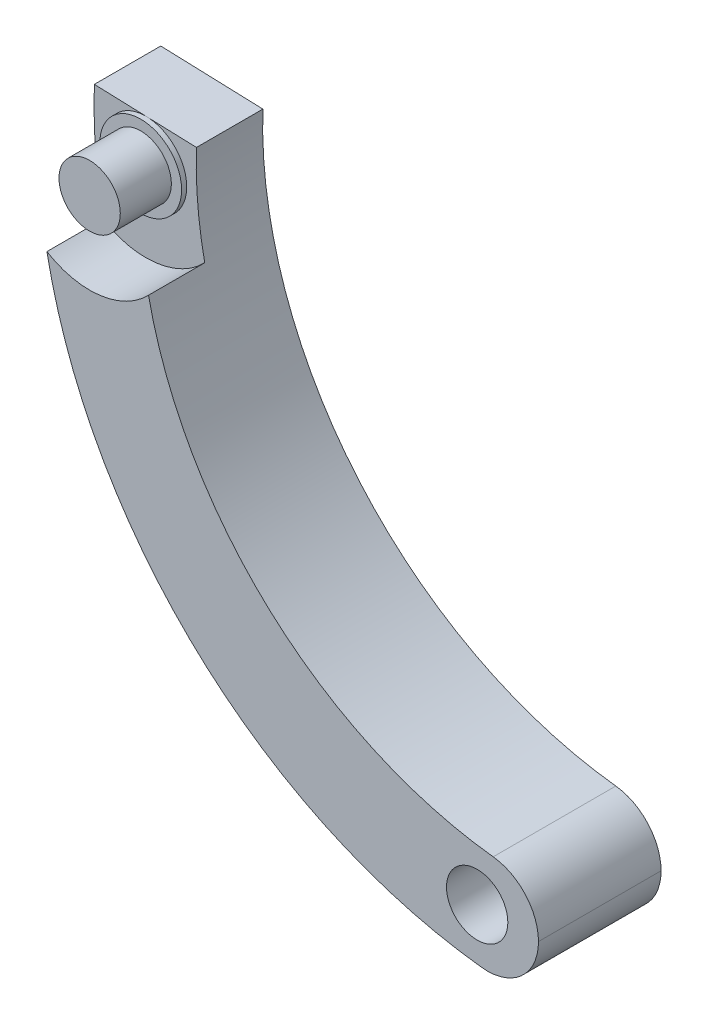
ISO-10303-21;
HEADER;
FILE_DESCRIPTION(('STEP AP214'),'2;1');
FILE_NAME('part.step','',(''),(''),'','','');
FILE_SCHEMA(('AUTOMOTIVE_DESIGN { 1 0 10303 214 1 1 1 1 }'));
ENDSEC;
DATA;
#1=APPLICATION_CONTEXT('core data for automotive mechanical design processes');
#2=APPLICATION_PROTOCOL_DEFINITION('international standard','automotive_design',2000,#1);
#3=PRODUCT_CONTEXT('',#1,'mechanical');
#4=PRODUCT('Part','Part','',(#3));
#5=PRODUCT_RELATED_PRODUCT_CATEGORY('part','',(#4));
#6=PRODUCT_DEFINITION_FORMATION('','',#4);
#7=PRODUCT_DEFINITION_CONTEXT('part definition',#1,'design');
#8=PRODUCT_DEFINITION('design','',#6,#7);
#9=PRODUCT_DEFINITION_SHAPE('','',#8);
#10=(LENGTH_UNIT() NAMED_UNIT(*) SI_UNIT(.MILLI.,.METRE.));
#11=(NAMED_UNIT(*) PLANE_ANGLE_UNIT() SI_UNIT($,.RADIAN.));
#12=(NAMED_UNIT(*) SI_UNIT($,.STERADIAN.) SOLID_ANGLE_UNIT());
#13=UNCERTAINTY_MEASURE_WITH_UNIT(LENGTH_MEASURE(1.E-05),#10,'distance_accuracy_value','');
#14=(GEOMETRIC_REPRESENTATION_CONTEXT(3) GLOBAL_UNCERTAINTY_ASSIGNED_CONTEXT((#13)) GLOBAL_UNIT_ASSIGNED_CONTEXT((#10,
#11,#12)) REPRESENTATION_CONTEXT('',''));
#15=CARTESIAN_POINT('',(0.,0.,0.));
#16=DIRECTION('',(0.,0.,1.));
#17=DIRECTION('',(1.,0.,0.));
#18=AXIS2_PLACEMENT_3D('',#15,#16,#17);
#19=CARTESIAN_POINT('',(-43.9309426651924,36.5358010332812,6.5));
#20=DIRECTION('',(0.,0.,1.));
#21=DIRECTION('',(1.,0.,0.));
#22=AXIS2_PLACEMENT_3D('',#19,#20,#21);
#23=PLANE('',#22);
#24=DIRECTION('',(-0.999390827019096,0.0348994967024965,0.));
#25=VECTOR('',#24,1.);
#26=CARTESIAN_POINT('',(-38.9762422537448,40.3610803713974,6.5));
#27=LINE('',#26,#25);
#28=CARTESIAN_POINT('',(-38.9762422537448,40.3610803713974,6.5));
#29=VERTEX_POINT('',#28);
#30=CARTESIAN_POINT('',(-43.609781542651,40.5228871288362,6.5));
#31=VERTEX_POINT('',#30);
#32=EDGE_CURVE('E111',#29,#31,#27,.T.);
#33=ORIENTED_EDGE('',*,*,#32,.T.);
#34=CARTESIAN_POINT('',(-43.9309426651924,36.5358010332812,6.5));
#35=DIRECTION('',(0.,0.,1.));
#36=DIRECTION('',(1.,0.,0.));
#37=AXIS2_PLACEMENT_3D('',#34,#35,#36);
#38=CIRCLE('',#37,4.00000000000001);
#39=CARTESIAN_POINT('',(-43.9731963888406,40.5355778549099,6.5));
#40=VERTEX_POINT('',#39);
#41=EDGE_CURVE('E100',#40,#31,#38,.T.);
#42=ORIENTED_EDGE('',*,*,#41,.F.);
#43=CARTESIAN_POINT('',(-48.9701505239357,40.7100753384224,6.5));
#44=VERTEX_POINT('',#43);
#45=EDGE_CURVE('E37',#40,#44,#27,.T.);
#46=ORIENTED_EDGE('',*,*,#45,.T.);
#47=CARTESIAN_POINT('',(0.,39.,6.5));
#48=DIRECTION('',(0.,0.,1.));
#49=DIRECTION('',(1.,0.,0.));
#50=AXIS2_PLACEMENT_3D('',#47,#48,#49);
#51=CIRCLE('',#50,49.);
#52=CARTESIAN_POINT('',(-48.1123588878088,29.7155548226785,6.5));
#53=VERTEX_POINT('',#52);
#54=EDGE_CURVE('E43',#44,#53,#51,.T.);
#55=ORIENTED_EDGE('',*,*,#54,.T.);
#56=CARTESIAN_POINT('',(-43.9309426651924,36.5358010332812,6.5));
#57=DIRECTION('',(0.,0.,1.));
#58=DIRECTION('',(1.,0.,0.));
#59=AXIS2_PLACEMENT_3D('',#56,#57,#58);
#60=CIRCLE('',#59,8.);
#61=CARTESIAN_POINT('',(-38.1679636420063,30.9871009352117,6.5));
#62=VERTEX_POINT('',#61);
#63=EDGE_CURVE('E170',#53,#62,#60,.T.);
#64=ORIENTED_EDGE('',*,*,#63,.T.);
#65=CARTESIAN_POINT('',(0.,39.,6.5));
#66=DIRECTION('',(0.,0.,1.));
#67=DIRECTION('',(1.,0.,0.));
#68=AXIS2_PLACEMENT_3D('',#65,#66,#67);
#69=CIRCLE('',#68,39.);
#70=EDGE_CURVE('E118',#62,#29,#69,.F.);
#71=ORIENTED_EDGE('',*,*,#70,.T.);
#72=EDGE_LOOP('',(#33,#42,#46,#55,#64,#71));
#73=FACE_BOUND('',#72,.T.);
#74=ADVANCED_FACE('F33',(#73),#23,.T.);
#75=CARTESIAN_POINT('',(-38.9762422537448,40.3610803713974,12.));
#76=DIRECTION('',(-0.0348994967024965,-0.999390827019096,0.));
#77=DIRECTION('',(0.999390827019096,-0.0348994967024965,0.));
#78=AXIS2_PLACEMENT_3D('',#75,#76,#77);
#79=PLANE('',#78);
#80=ORIENTED_EDGE('',*,*,#32,.F.);
#81=DIRECTION('',(0.,0.,-1.));
#82=VECTOR('',#81,1.);
#83=CARTESIAN_POINT('',(-38.9762422537448,40.3610803713974,12.));
#84=LINE('',#83,#82);
#85=CARTESIAN_POINT('',(-38.9762422537448,40.3610803713974,0.));
#86=VERTEX_POINT('',#85);
#87=EDGE_CURVE('E152',#29,#86,#84,.T.);
#88=ORIENTED_EDGE('',*,*,#87,.T.);
#89=DIRECTION('',(-0.999390827019096,0.0348994967024965,0.));
#90=VECTOR('',#89,1.);
#91=CARTESIAN_POINT('',(-38.9762422537448,40.3610803713974,0.));
#92=LINE('',#91,#90);
#93=CARTESIAN_POINT('',(-48.9701505239357,40.7100753384224,0.));
#94=VERTEX_POINT('',#93);
#95=EDGE_CURVE('E146',#86,#94,#92,.T.);
#96=ORIENTED_EDGE('',*,*,#95,.T.);
#97=DIRECTION('',(0.,0.,-1.));
#98=VECTOR('',#97,1.);
#99=CARTESIAN_POINT('',(-48.9701505239357,40.7100753384224,12.));
#100=LINE('',#99,#98);
#101=EDGE_CURVE('E143',#44,#94,#100,.T.);
#102=ORIENTED_EDGE('',*,*,#101,.F.);
#103=ORIENTED_EDGE('',*,*,#45,.F.);
#104=CARTESIAN_POINT('',(-43.9309426651924,36.5358010332812,6.5));
#105=DIRECTION('',(0.,0.,1.));
#106=DIRECTION('',(0.0802902806353396,0.996771523888749,0.));
#107=AXIS2_PLACEMENT_3D('',#104,#105,#106);
#108=CIRCLE('',#107,4.00000000000001);
#109=EDGE_CURVE('E50',#31,#40,#108,.T.);
#110=ORIENTED_EDGE('',*,*,#109,.F.);
#111=EDGE_LOOP('',(#80,#88,#96,#102,#103,#110));
#112=FACE_BOUND('',#111,.T.);
#113=ADVANCED_FACE('F110',(#112),#79,.F.);
#114=CARTESIAN_POINT('',(0.,39.,12.));
#115=DIRECTION('',(0.,0.,-1.));
#116=DIRECTION('',(-1.,0.,0.));
#117=AXIS2_PLACEMENT_3D('',#114,#115,#116);
#118=CYLINDRICAL_SURFACE('',#117,39.);
#119=ORIENTED_EDGE('',*,*,#70,.F.);
#120=DIRECTION('',(0.,0.,1.));
#121=VECTOR('',#120,1.);
#122=CARTESIAN_POINT('',(-38.1679636420063,30.9871009352117,9.25));
#123=LINE('',#122,#121);
#124=CARTESIAN_POINT('',(-38.1679636420063,30.9871009352117,12.));
#125=VERTEX_POINT('',#124);
#126=EDGE_CURVE('E121',#62,#125,#123,.T.);
#127=ORIENTED_EDGE('',*,*,#126,.T.);
#128=CARTESIAN_POINT('',(0.,39.,12.));
#129=DIRECTION('',(0.,0.,-1.));
#130=DIRECTION('',(-1.,0.,0.));
#131=AXIS2_PLACEMENT_3D('',#128,#129,#130);
#132=CIRCLE('',#131,39.);
#133=CARTESIAN_POINT('',(-4.43181818181818,0.252626055391753,12.));
#134=VERTEX_POINT('',#133);
#135=EDGE_CURVE('E137',#134,#125,#132,.T.);
#136=ORIENTED_EDGE('',*,*,#135,.F.);
#137=DIRECTION('',(0.,0.,-1.));
#138=VECTOR('',#137,1.);
#139=CARTESIAN_POINT('',(-4.43181818181818,0.252626055391753,12.));
#140=LINE('',#139,#138);
#141=CARTESIAN_POINT('',(-4.43181818181818,0.252626055391753,0.));
#142=VERTEX_POINT('',#141);
#143=EDGE_CURVE('E165',#134,#142,#140,.T.);
#144=ORIENTED_EDGE('',*,*,#143,.T.);
#145=CARTESIAN_POINT('',(0.,39.,0.));
#146=DIRECTION('',(0.,0.,-1.));
#147=DIRECTION('',(-1.,0.,0.));
#148=AXIS2_PLACEMENT_3D('',#145,#146,#147);
#149=CIRCLE('',#148,39.);
#150=EDGE_CURVE('E136',#142,#86,#149,.T.);
#151=ORIENTED_EDGE('',*,*,#150,.T.);
#152=ORIENTED_EDGE('',*,*,#87,.F.);
#153=EDGE_LOOP('',(#119,#127,#136,#144,#151,#152));
#154=FACE_BOUND('',#153,.T.);
#155=ADVANCED_FACE('F219',(#154),#118,.F.);
#156=CARTESIAN_POINT('',(0.,39.,12.));
#157=DIRECTION('',(0.,0.,-1.));
#158=DIRECTION('',(-1.,0.,0.));
#159=AXIS2_PLACEMENT_3D('',#156,#157,#158);
#160=CYLINDRICAL_SURFACE('',#159,49.);
#161=CARTESIAN_POINT('',(0.,39.,12.));
#162=DIRECTION('',(0.,0.,1.));
#163=DIRECTION('',(-1.,0.,0.));
#164=AXIS2_PLACEMENT_3D('',#161,#162,#163);
#165=CIRCLE('',#164,49.);
#166=CARTESIAN_POINT('',(-48.1123588878088,29.7155548226785,12.));
#167=VERTEX_POINT('',#166);
#168=CARTESIAN_POINT('',(-5.56818181818182,-9.68259803296934,12.));
#169=VERTEX_POINT('',#168);
#170=EDGE_CURVE('E140',#167,#169,#165,.T.);
#171=ORIENTED_EDGE('',*,*,#170,.F.);
#172=DIRECTION('',(0.,0.,1.));
#173=VECTOR('',#172,1.);
#174=CARTESIAN_POINT('',(-48.1123588878088,29.7155548226785,9.25));
#175=LINE('',#174,#173);
#176=EDGE_CURVE('E59',#167,#53,#175,.F.);
#177=ORIENTED_EDGE('',*,*,#176,.T.);
#178=ORIENTED_EDGE('',*,*,#54,.F.);
#179=ORIENTED_EDGE('',*,*,#101,.T.);
#180=CARTESIAN_POINT('',(0.,39.,0.));
#181=DIRECTION('',(0.,0.,1.));
#182=DIRECTION('',(-1.,0.,0.));
#183=AXIS2_PLACEMENT_3D('',#180,#181,#182);
#184=CIRCLE('',#183,49.);
#185=CARTESIAN_POINT('',(-5.56818181818182,-9.68259803296934,0.));
#186=VERTEX_POINT('',#185);
#187=EDGE_CURVE('E141',#94,#186,#184,.T.);
#188=ORIENTED_EDGE('',*,*,#187,.T.);
#189=DIRECTION('',(0.,0.,-1.));
#190=VECTOR('',#189,1.);
#191=CARTESIAN_POINT('',(-5.56818181818182,-9.68259803296934,12.));
#192=LINE('',#191,#190);
#193=EDGE_CURVE('E158',#186,#169,#192,.F.);
#194=ORIENTED_EDGE('',*,*,#193,.T.);
#195=EDGE_LOOP('',(#171,#177,#178,#179,#188,#194));
#196=FACE_BOUND('',#195,.T.);
#197=ADVANCED_FACE('F177',(#196),#160,.T.);
#198=CARTESIAN_POINT('',(0.,39.,12.));
#199=DIRECTION('',(0.,0.,-1.));
#200=DIRECTION('',(-1.,0.,0.));
#201=AXIS2_PLACEMENT_3D('',#198,#199,#200);
#202=PLANE('',#201);
#203=CARTESIAN_POINT('',(-6.,-4.58898943540673,12.));
#204=DIRECTION('',(0.,0.,-1.));
#205=DIRECTION('',(-1.,0.,0.));
#206=AXIS2_PLACEMENT_3D('',#203,#204,#205);
#207=CIRCLE('',#206,3.);
#208=CARTESIAN_POINT('',(-9.,-4.58898943540673,12.));
#209=VERTEX_POINT('',#208);
#210=EDGE_CURVE('E133',#209,#209,#207,.T.);
#211=ORIENTED_EDGE('',*,*,#210,.T.);
#212=EDGE_LOOP('',(#211));
#213=FACE_BOUND('',#212,.T.);
#214=ORIENTED_EDGE('',*,*,#135,.T.);
#215=CARTESIAN_POINT('',(-43.9309426651924,36.5358010332812,12.));
#216=DIRECTION('',(0.,0.,1.));
#217=DIRECTION('',(1.,0.,0.));
#218=AXIS2_PLACEMENT_3D('',#215,#216,#217);
#219=CIRCLE('',#218,8.);
#220=EDGE_CURVE('E174',#167,#125,#219,.T.);
#221=ORIENTED_EDGE('',*,*,#220,.F.);
#222=ORIENTED_EDGE('',*,*,#170,.T.);
#223=CARTESIAN_POINT('',(-5.,-4.71498598878879,12.));
#224=DIRECTION('',(0.,0.,-1.));
#225=DIRECTION('',(-1.,0.,0.));
#226=AXIS2_PLACEMENT_3D('',#223,#224,#225);
#227=CIRCLE('',#226,5.);
#228=CARTESIAN_POINT('',(0.,-4.71498598878879,12.));
#229=VERTEX_POINT('',#228);
#230=EDGE_CURVE('E163',#169,#229,#227,.F.);
#231=ORIENTED_EDGE('',*,*,#230,.T.);
#232=CARTESIAN_POINT('',(-5.,-4.71498598878879,12.));
#233=DIRECTION('',(0.,0.,-1.));
#234=DIRECTION('',(-1.,0.,0.));
#235=AXIS2_PLACEMENT_3D('',#232,#233,#234);
#236=CIRCLE('',#235,5.);
#237=EDGE_CURVE('E161',#229,#134,#236,.F.);
#238=ORIENTED_EDGE('',*,*,#237,.T.);
#239=EDGE_LOOP('',(#214,#221,#222,#231,#238));
#240=FACE_BOUND('',#239,.T.);
#241=ADVANCED_FACE('F211',(#213,#240),#202,.F.);
#242=CARTESIAN_POINT('',(0.,39.,0.));
#243=DIRECTION('',(0.,0.,-1.));
#244=DIRECTION('',(-1.,0.,0.));
#245=AXIS2_PLACEMENT_3D('',#242,#243,#244);
#246=PLANE('',#245);
#247=CARTESIAN_POINT('',(-6.,-4.58898943540673,0.));
#248=DIRECTION('',(0.,0.,1.));
#249=DIRECTION('',(1.,0.,0.));
#250=AXIS2_PLACEMENT_3D('',#247,#248,#249);
#251=CIRCLE('',#250,3.);
#252=CARTESIAN_POINT('',(-3.,-4.58898943540673,0.));
#253=VERTEX_POINT('',#252);
#254=EDGE_CURVE('E130',#253,#253,#251,.T.);
#255=ORIENTED_EDGE('',*,*,#254,.T.);
#256=EDGE_LOOP('',(#255));
#257=FACE_BOUND('',#256,.T.);
#258=CARTESIAN_POINT('',(-5.,-4.71498598878879,0.));
#259=DIRECTION('',(0.,0.,-1.));
#260=DIRECTION('',(-1.,0.,0.));
#261=AXIS2_PLACEMENT_3D('',#258,#259,#260);
#262=CIRCLE('',#261,5.);
#263=CARTESIAN_POINT('',(0.,-4.71498598878879,0.));
#264=VERTEX_POINT('',#263);
#265=EDGE_CURVE('E154',#142,#264,#262,.T.);
#266=ORIENTED_EDGE('',*,*,#265,.T.);
#267=CARTESIAN_POINT('',(-5.,-4.71498598878879,0.));
#268=DIRECTION('',(0.,0.,-1.));
#269=DIRECTION('',(-1.,0.,0.));
#270=AXIS2_PLACEMENT_3D('',#267,#268,#269);
#271=CIRCLE('',#270,5.);
#272=EDGE_CURVE('E156',#264,#186,#271,.T.);
#273=ORIENTED_EDGE('',*,*,#272,.T.);
#274=ORIENTED_EDGE('',*,*,#187,.F.);
#275=ORIENTED_EDGE('',*,*,#95,.F.);
#276=ORIENTED_EDGE('',*,*,#150,.F.);
#277=EDGE_LOOP('',(#266,#273,#274,#275,#276));
#278=FACE_BOUND('',#277,.T.);
#279=ADVANCED_FACE('F209',(#257,#278),#246,.T.);
#280=CARTESIAN_POINT('',(-6.,-4.58898943540673,0.));
#281=DIRECTION('',(0.,0.,1.));
#282=DIRECTION('',(1.,0.,0.));
#283=AXIS2_PLACEMENT_3D('',#280,#281,#282);
#284=CYLINDRICAL_SURFACE('',#283,3.);
#285=ORIENTED_EDGE('',*,*,#254,.F.);
#286=EDGE_LOOP('',(#285));
#287=FACE_BOUND('',#286,.T.);
#288=ORIENTED_EDGE('',*,*,#210,.F.);
#289=EDGE_LOOP('',(#288));
#290=FACE_BOUND('',#289,.T.);
#291=ADVANCED_FACE('F206',(#287,#290),#284,.F.);
#292=CARTESIAN_POINT('',(-5.,-4.71498598878879,12.));
#293=DIRECTION('',(0.,0.,-1.));
#294=DIRECTION('',(-1.,0.,0.));
#295=AXIS2_PLACEMENT_3D('',#292,#293,#294);
#296=CYLINDRICAL_SURFACE('',#295,5.);
#297=ORIENTED_EDGE('',*,*,#143,.F.);
#298=ORIENTED_EDGE('',*,*,#237,.F.);
#299=DIRECTION('',(0.,0.,-1.));
#300=VECTOR('',#299,1.);
#301=CARTESIAN_POINT('',(0.,-4.71498598878879,12.));
#302=LINE('',#301,#300);
#303=EDGE_CURVE('E119',#264,#229,#302,.F.);
#304=ORIENTED_EDGE('',*,*,#303,.F.);
#305=ORIENTED_EDGE('',*,*,#265,.F.);
#306=EDGE_LOOP('',(#297,#298,#304,#305));
#307=FACE_BOUND('',#306,.T.);
#308=ADVANCED_FACE('F35',(#307),#296,.T.);
#309=CARTESIAN_POINT('',(-5.,-4.71498598878879,12.));
#310=DIRECTION('',(0.,0.,-1.));
#311=DIRECTION('',(-1.,0.,0.));
#312=AXIS2_PLACEMENT_3D('',#309,#310,#311);
#313=CYLINDRICAL_SURFACE('',#312,5.);
#314=ORIENTED_EDGE('',*,*,#230,.F.);
#315=ORIENTED_EDGE('',*,*,#193,.F.);
#316=ORIENTED_EDGE('',*,*,#272,.F.);
#317=ORIENTED_EDGE('',*,*,#303,.T.);
#318=EDGE_LOOP('',(#314,#315,#316,#317));
#319=FACE_BOUND('',#318,.T.);
#320=ADVANCED_FACE('F205',(#319),#313,.T.);
#321=CARTESIAN_POINT('',(-43.9309426651924,36.5358010332812,6.5));
#322=DIRECTION('',(0.,0.,1.));
#323=DIRECTION('',(1.,0.,0.));
#324=AXIS2_PLACEMENT_3D('',#321,#322,#323);
#325=CYLINDRICAL_SURFACE('',#324,8.);
#326=ORIENTED_EDGE('',*,*,#63,.F.);
#327=ORIENTED_EDGE('',*,*,#176,.F.);
#328=ORIENTED_EDGE('',*,*,#220,.T.);
#329=ORIENTED_EDGE('',*,*,#126,.F.);
#330=EDGE_LOOP('',(#326,#327,#328,#329));
#331=FACE_BOUND('',#330,.T.);
#332=ADVANCED_FACE('F172',(#331),#325,.F.);
#333=CARTESIAN_POINT('',(-43.9309426651924,36.5358010332812,7.));
#334=DIRECTION('',(0.,0.,1.));
#335=DIRECTION('',(1.,0.,0.));
#336=AXIS2_PLACEMENT_3D('',#333,#334,#335);
#337=PLANE('',#336);
#338=CARTESIAN_POINT('',(-43.9309426651924,36.5358010332812,7.));
#339=DIRECTION('',(0.,0.,1.));
#340=DIRECTION('',(1.,0.,0.));
#341=AXIS2_PLACEMENT_3D('',#338,#339,#340);
#342=CIRCLE('',#341,4.00000000000001);
#343=CARTESIAN_POINT('',(-39.9309426651924,36.5358010332812,7.));
#344=VERTEX_POINT('',#343);
#345=EDGE_CURVE('E105',#344,#344,#342,.T.);
#346=ORIENTED_EDGE('',*,*,#345,.T.);
#347=EDGE_LOOP('',(#346));
#348=FACE_BOUND('',#347,.T.);
#349=CARTESIAN_POINT('',(-43.9309426651924,36.5358010332812,7.));
#350=DIRECTION('',(0.,0.,1.));
#351=DIRECTION('',(1.,0.,0.));
#352=AXIS2_PLACEMENT_3D('',#349,#350,#351);
#353=CIRCLE('',#352,3.);
#354=CARTESIAN_POINT('',(-40.9309426651924,36.5358010332812,7.));
#355=VERTEX_POINT('',#354);
#356=EDGE_CURVE('E11',#355,#355,#353,.F.);
#357=ORIENTED_EDGE('',*,*,#356,.T.);
#358=EDGE_LOOP('',(#357));
#359=FACE_BOUND('',#358,.T.);
#360=ADVANCED_FACE('F195',(#348,#359),#337,.T.);
#361=CARTESIAN_POINT('',(-43.9309426651924,36.5358010332812,7.));
#362=DIRECTION('',(0.,0.,-1.));
#363=DIRECTION('',(-1.,0.,0.));
#364=AXIS2_PLACEMENT_3D('',#361,#362,#363);
#365=CYLINDRICAL_SURFACE('',#364,4.00000000000001);
#366=ORIENTED_EDGE('',*,*,#345,.F.);
#367=EDGE_LOOP('',(#366));
#368=FACE_BOUND('',#367,.T.);
#369=ORIENTED_EDGE('',*,*,#109,.T.);
#370=ORIENTED_EDGE('',*,*,#41,.T.);
#371=EDGE_LOOP('',(#369,#370));
#372=FACE_BOUND('',#371,.T.);
#373=ADVANCED_FACE('F101',(#368,#372),#365,.T.);
#374=CARTESIAN_POINT('',(-43.9309426651924,36.5358010332812,12.));
#375=DIRECTION('',(0.,0.,1.));
#376=DIRECTION('',(1.,0.,0.));
#377=AXIS2_PLACEMENT_3D('',#374,#375,#376);
#378=CIRCLE('',#377,3.);
#379=CARTESIAN_POINT('',(-40.9309426651924,36.5358010332812,12.));
#380=VERTEX_POINT('',#379);
#381=EDGE_CURVE('E114',#380,#380,#378,.T.);
#382=ORIENTED_EDGE('',*,*,#381,.T.);
#383=EDGE_LOOP('',(#382));
#384=FACE_BOUND('',#383,.T.);
#385=ADVANCED_FACE('F194',(#384),#202,.F.);
#386=CARTESIAN_POINT('',(-43.9309426651924,36.5358010332812,6.5));
#387=DIRECTION('',(0.,0.,1.));
#388=DIRECTION('',(1.,0.,0.));
#389=AXIS2_PLACEMENT_3D('',#386,#387,#388);
#390=CYLINDRICAL_SURFACE('',#389,3.);
#391=ORIENTED_EDGE('',*,*,#356,.F.);
#392=EDGE_LOOP('',(#391));
#393=FACE_BOUND('',#392,.T.);
#394=ORIENTED_EDGE('',*,*,#381,.F.);
#395=EDGE_LOOP('',(#394));
#396=FACE_BOUND('',#395,.T.);
#397=ADVANCED_FACE('F197',(#393,#396),#390,.T.);
#398=CLOSED_SHELL('',(#74,#113,#155,#197,#241,#279,#291,#308,#320,#332,#360,#373,#385,#397));
#399=MANIFOLD_SOLID_BREP('B2',#398);
#400=ADVANCED_BREP_SHAPE_REPRESENTATION('',(#18,#399),#14);
#401=SHAPE_DEFINITION_REPRESENTATION(#9,#400);
ENDSEC;
END-ISO-10303-21;
